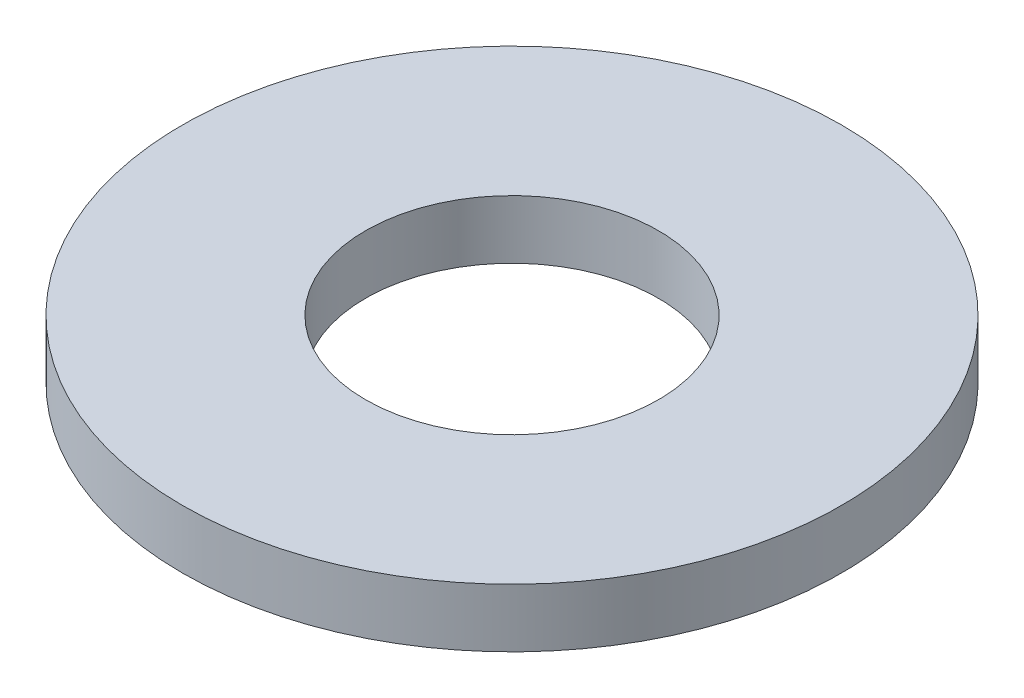
ISO-10303-21;
HEADER;
FILE_DESCRIPTION(('STEP AP214'),'2;1');
FILE_NAME('part.step','',(''),(''),'','','');
FILE_SCHEMA(('AUTOMOTIVE_DESIGN { 1 0 10303 214 1 1 1 1 }'));
ENDSEC;
DATA;
#1=APPLICATION_CONTEXT('core data for automotive mechanical design processes');
#2=APPLICATION_PROTOCOL_DEFINITION('international standard','automotive_design',2000,#1);
#3=PRODUCT_CONTEXT('',#1,'mechanical');
#4=PRODUCT('Part','Part','',(#3));
#5=PRODUCT_RELATED_PRODUCT_CATEGORY('part','',(#4));
#6=PRODUCT_DEFINITION_FORMATION('','',#4);
#7=PRODUCT_DEFINITION_CONTEXT('part definition',#1,'design');
#8=PRODUCT_DEFINITION('design','',#6,#7);
#9=PRODUCT_DEFINITION_SHAPE('','',#8);
#10=(LENGTH_UNIT() NAMED_UNIT(*) SI_UNIT(.MILLI.,.METRE.));
#11=(NAMED_UNIT(*) PLANE_ANGLE_UNIT() SI_UNIT($,.RADIAN.));
#12=(NAMED_UNIT(*) SI_UNIT($,.STERADIAN.) SOLID_ANGLE_UNIT());
#13=UNCERTAINTY_MEASURE_WITH_UNIT(LENGTH_MEASURE(1.E-05),#10,'distance_accuracy_value','');
#14=(GEOMETRIC_REPRESENTATION_CONTEXT(3) GLOBAL_UNCERTAINTY_ASSIGNED_CONTEXT((#13)) GLOBAL_UNIT_ASSIGNED_CONTEXT((#10,
#11,#12)) REPRESENTATION_CONTEXT('',''));
#15=CARTESIAN_POINT('',(0.,0.,0.));
#16=DIRECTION('',(0.,0.,1.));
#17=DIRECTION('',(1.,0.,0.));
#18=AXIS2_PLACEMENT_3D('',#15,#16,#17);
#19=CARTESIAN_POINT('',(0.,1.6,0.));
#20=DIRECTION('',(0.,1.,0.));
#21=DIRECTION('',(0.,0.,1.));
#22=AXIS2_PLACEMENT_3D('',#19,#20,#21);
#23=PLANE('',#22);
#24=CARTESIAN_POINT('',(0.,1.6,0.));
#25=DIRECTION('',(0.,1.,0.));
#26=DIRECTION('',(0.,0.,1.));
#27=AXIS2_PLACEMENT_3D('',#24,#25,#26);
#28=CIRCLE('',#27,9.);
#29=CARTESIAN_POINT('',(0.,1.6,9.));
#30=VERTEX_POINT('',#29);
#31=EDGE_CURVE('E10',#30,#30,#28,.T.);
#32=ORIENTED_EDGE('',*,*,#31,.T.);
#33=EDGE_LOOP('',(#32));
#34=FACE_BOUND('',#33,.T.);
#35=CARTESIAN_POINT('',(0.,1.6,0.));
#36=DIRECTION('',(0.,1.,0.));
#37=DIRECTION('',(0.,0.,1.));
#38=AXIS2_PLACEMENT_3D('',#35,#36,#37);
#39=CIRCLE('',#38,4.);
#40=CARTESIAN_POINT('',(0.,1.6,4.));
#41=VERTEX_POINT('',#40);
#42=EDGE_CURVE('E42',#41,#41,#39,.T.);
#43=ORIENTED_EDGE('',*,*,#42,.F.);
#44=EDGE_LOOP('',(#43));
#45=FACE_BOUND('',#44,.T.);
#46=ADVANCED_FACE('F31',(#34,#45),#23,.T.);
#47=CARTESIAN_POINT('',(0.,0.,0.));
#48=DIRECTION('',(0.,1.,0.));
#49=DIRECTION('',(0.,0.,1.));
#50=AXIS2_PLACEMENT_3D('',#47,#48,#49);
#51=PLANE('',#50);
#52=CARTESIAN_POINT('',(0.,0.,0.));
#53=DIRECTION('',(0.,1.,0.));
#54=DIRECTION('',(0.,0.,1.));
#55=AXIS2_PLACEMENT_3D('',#52,#53,#54);
#56=CIRCLE('',#55,9.);
#57=CARTESIAN_POINT('',(0.,0.,9.));
#58=VERTEX_POINT('',#57);
#59=EDGE_CURVE('E35',#58,#58,#56,.T.);
#60=ORIENTED_EDGE('',*,*,#59,.F.);
#61=EDGE_LOOP('',(#60));
#62=FACE_BOUND('',#61,.T.);
#63=CARTESIAN_POINT('',(0.,0.,0.));
#64=DIRECTION('',(0.,1.,0.));
#65=DIRECTION('',(0.,0.,1.));
#66=AXIS2_PLACEMENT_3D('',#63,#64,#65);
#67=CIRCLE('',#66,4.);
#68=CARTESIAN_POINT('',(0.,0.,4.));
#69=VERTEX_POINT('',#68);
#70=EDGE_CURVE('E44',#69,#69,#67,.T.);
#71=ORIENTED_EDGE('',*,*,#70,.T.);
#72=EDGE_LOOP('',(#71));
#73=FACE_BOUND('',#72,.T.);
#74=ADVANCED_FACE('F54',(#62,#73),#51,.F.);
#75=CARTESIAN_POINT('',(0.,1.6,0.));
#76=DIRECTION('',(0.,-1.,0.));
#77=DIRECTION('',(0.,0.,-1.));
#78=AXIS2_PLACEMENT_3D('',#75,#76,#77);
#79=CYLINDRICAL_SURFACE('',#78,9.);
#80=ORIENTED_EDGE('',*,*,#31,.F.);
#81=EDGE_LOOP('',(#80));
#82=FACE_BOUND('',#81,.T.);
#83=ORIENTED_EDGE('',*,*,#59,.T.);
#84=EDGE_LOOP('',(#83));
#85=FACE_BOUND('',#84,.T.);
#86=ADVANCED_FACE('F33',(#82,#85),#79,.T.);
#87=CARTESIAN_POINT('',(0.,1.6,0.));
#88=DIRECTION('',(0.,-1.,0.));
#89=DIRECTION('',(0.,0.,-1.));
#90=AXIS2_PLACEMENT_3D('',#87,#88,#89);
#91=CYLINDRICAL_SURFACE('',#90,4.);
#92=ORIENTED_EDGE('',*,*,#42,.T.);
#93=EDGE_LOOP('',(#92));
#94=FACE_BOUND('',#93,.T.);
#95=ORIENTED_EDGE('',*,*,#70,.F.);
#96=EDGE_LOOP('',(#95));
#97=FACE_BOUND('',#96,.T.);
#98=ADVANCED_FACE('F50',(#94,#97),#91,.F.);
#99=CLOSED_SHELL('',(#46,#74,#86,#98));
#100=MANIFOLD_SOLID_BREP('B2',#99);
#101=ADVANCED_BREP_SHAPE_REPRESENTATION('',(#18,#100),#14);
#102=SHAPE_DEFINITION_REPRESENTATION(#9,#101);
ENDSEC;
END-ISO-10303-21;
